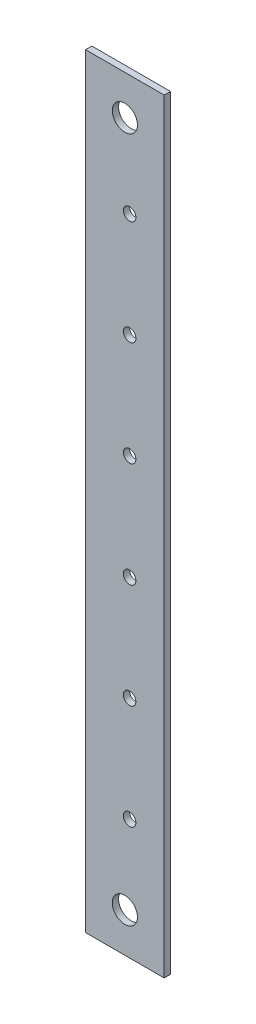
ISO-10303-21;
HEADER;
FILE_DESCRIPTION(('STEP AP214'),'2;1');
FILE_NAME('part.step','',(''),(''),'','','');
FILE_SCHEMA(('AUTOMOTIVE_DESIGN { 1 0 10303 214 1 1 1 1 }'));
ENDSEC;
DATA;
#1=APPLICATION_CONTEXT('core data for automotive mechanical design processes');
#2=APPLICATION_PROTOCOL_DEFINITION('international standard','automotive_design',2000,#1);
#3=PRODUCT_CONTEXT('',#1,'mechanical');
#4=PRODUCT('Part','Part','',(#3));
#5=PRODUCT_RELATED_PRODUCT_CATEGORY('part','',(#4));
#6=PRODUCT_DEFINITION_FORMATION('','',#4);
#7=PRODUCT_DEFINITION_CONTEXT('part definition',#1,'design');
#8=PRODUCT_DEFINITION('design','',#6,#7);
#9=PRODUCT_DEFINITION_SHAPE('','',#8);
#10=(LENGTH_UNIT() NAMED_UNIT(*) SI_UNIT(.MILLI.,.METRE.));
#11=(NAMED_UNIT(*) PLANE_ANGLE_UNIT() SI_UNIT($,.RADIAN.));
#12=(NAMED_UNIT(*) SI_UNIT($,.STERADIAN.) SOLID_ANGLE_UNIT());
#13=UNCERTAINTY_MEASURE_WITH_UNIT(LENGTH_MEASURE(1.E-05),#10,'distance_accuracy_value','');
#14=(GEOMETRIC_REPRESENTATION_CONTEXT(3) GLOBAL_UNCERTAINTY_ASSIGNED_CONTEXT((#13)) GLOBAL_UNIT_ASSIGNED_CONTEXT((#10,
#11,#12)) REPRESENTATION_CONTEXT('',''));
#15=CARTESIAN_POINT('',(0.,0.,0.));
#16=DIRECTION('',(0.,0.,1.));
#17=DIRECTION('',(1.,0.,0.));
#18=AXIS2_PLACEMENT_3D('',#15,#16,#17);
#19=CARTESIAN_POINT('',(0.,0.,2.));
#20=DIRECTION('',(0.,0.,1.));
#21=DIRECTION('',(1.,0.,0.));
#22=AXIS2_PLACEMENT_3D('',#19,#20,#21);
#23=PLANE('',#22);
#24=CARTESIAN_POINT('',(1.49999999999956,83.3000000000004,2.));
#25=DIRECTION('',(0.,0.,1.));
#26=DIRECTION('',(1.,0.,0.));
#27=AXIS2_PLACEMENT_3D('',#24,#25,#26);
#28=CIRCLE('',#27,2.);
#29=CARTESIAN_POINT('',(3.49999999999956,83.3000000000004,2.));
#30=VERTEX_POINT('',#29);
#31=EDGE_CURVE('E151',#30,#30,#28,.T.);
#32=ORIENTED_EDGE('',*,*,#31,.F.);
#33=EDGE_LOOP('',(#32));
#34=FACE_BOUND('',#33,.T.);
#35=CARTESIAN_POINT('',(1.49999999999956,50.0000000000004,2.));
#36=DIRECTION('',(0.,0.,1.));
#37=DIRECTION('',(1.,0.,0.));
#38=AXIS2_PLACEMENT_3D('',#35,#36,#37);
#39=CIRCLE('',#38,2.);
#40=CARTESIAN_POINT('',(3.49999999999956,50.0000000000004,2.));
#41=VERTEX_POINT('',#40);
#42=EDGE_CURVE('E145',#41,#41,#39,.T.);
#43=ORIENTED_EDGE('',*,*,#42,.F.);
#44=EDGE_LOOP('',(#43));
#45=FACE_BOUND('',#44,.T.);
#46=CARTESIAN_POINT('',(1.49999999999956,16.7000000000004,2.));
#47=DIRECTION('',(0.,0.,1.));
#48=DIRECTION('',(1.,0.,0.));
#49=AXIS2_PLACEMENT_3D('',#46,#47,#48);
#50=CIRCLE('',#49,2.);
#51=CARTESIAN_POINT('',(3.49999999999956,16.7000000000004,2.));
#52=VERTEX_POINT('',#51);
#53=EDGE_CURVE('E139',#52,#52,#50,.T.);
#54=ORIENTED_EDGE('',*,*,#53,.F.);
#55=EDGE_LOOP('',(#54));
#56=FACE_BOUND('',#55,.T.);
#57=CARTESIAN_POINT('',(1.49999999999956,-16.7000000000006,2.));
#58=DIRECTION('',(0.,0.,1.));
#59=DIRECTION('',(1.,0.,0.));
#60=AXIS2_PLACEMENT_3D('',#57,#58,#59);
#61=CIRCLE('',#60,2.00000000000027);
#62=CARTESIAN_POINT('',(3.49999999999983,-16.7000000000006,2.));
#63=VERTEX_POINT('',#62);
#64=EDGE_CURVE('E133',#63,#63,#61,.T.);
#65=ORIENTED_EDGE('',*,*,#64,.F.);
#66=EDGE_LOOP('',(#65));
#67=FACE_BOUND('',#66,.T.);
#68=CARTESIAN_POINT('',(1.49999999999956,-50.0000000000006,2.));
#69=DIRECTION('',(0.,0.,1.));
#70=DIRECTION('',(1.,0.,0.));
#71=AXIS2_PLACEMENT_3D('',#68,#69,#70);
#72=CIRCLE('',#71,2.00000000000027);
#73=CARTESIAN_POINT('',(3.49999999999983,-50.0000000000006,2.));
#74=VERTEX_POINT('',#73);
#75=EDGE_CURVE('E127',#74,#74,#72,.T.);
#76=ORIENTED_EDGE('',*,*,#75,.F.);
#77=EDGE_LOOP('',(#76));
#78=FACE_BOUND('',#77,.T.);
#79=CARTESIAN_POINT('',(1.49999999999956,-83.2999999999997,2.));
#80=DIRECTION('',(0.,0.,1.));
#81=DIRECTION('',(1.,0.,0.));
#82=AXIS2_PLACEMENT_3D('',#79,#80,#81);
#83=CIRCLE('',#82,2.);
#84=CARTESIAN_POINT('',(3.49999999999955,-83.2999999999997,2.));
#85=VERTEX_POINT('',#84);
#86=EDGE_CURVE('E121',#85,#85,#83,.T.);
#87=ORIENTED_EDGE('',*,*,#86,.F.);
#88=EDGE_LOOP('',(#87));
#89=FACE_BOUND('',#88,.T.);
#90=CARTESIAN_POINT('',(0.,109.,2.));
#91=DIRECTION('',(0.,0.,1.));
#92=DIRECTION('',(1.,0.,0.));
#93=AXIS2_PLACEMENT_3D('',#90,#91,#92);
#94=CIRCLE('',#93,4.);
#95=CARTESIAN_POINT('',(4.,109.,2.));
#96=VERTEX_POINT('',#95);
#97=EDGE_CURVE('E100',#96,#96,#94,.T.);
#98=ORIENTED_EDGE('',*,*,#97,.F.);
#99=EDGE_LOOP('',(#98));
#100=FACE_BOUND('',#99,.T.);
#101=DIRECTION('',(0.,1.,0.));
#102=VECTOR('',#101,1.);
#103=CARTESIAN_POINT('',(12.5,121.5,2.));
#104=LINE('',#103,#102);
#105=CARTESIAN_POINT('',(12.5,-121.5,2.));
#106=VERTEX_POINT('',#105);
#107=CARTESIAN_POINT('',(12.5,121.5,2.));
#108=VERTEX_POINT('',#107);
#109=EDGE_CURVE('E82',#106,#108,#104,.T.);
#110=ORIENTED_EDGE('',*,*,#109,.T.);
#111=DIRECTION('',(-1.,0.,0.));
#112=VECTOR('',#111,1.);
#113=CARTESIAN_POINT('',(3.5000000000001,121.5,2.));
#114=LINE('',#113,#112);
#115=CARTESIAN_POINT('',(-12.5,121.5,2.));
#116=VERTEX_POINT('',#115);
#117=EDGE_CURVE('E76',#108,#116,#114,.T.);
#118=ORIENTED_EDGE('',*,*,#117,.T.);
#119=DIRECTION('',(0.,-1.,0.));
#120=VECTOR('',#119,1.);
#121=CARTESIAN_POINT('',(-12.5,112.5,2.));
#122=LINE('',#121,#120);
#123=CARTESIAN_POINT('',(-12.5,-121.5,2.));
#124=VERTEX_POINT('',#123);
#125=EDGE_CURVE('E79',#116,#124,#122,.T.);
#126=ORIENTED_EDGE('',*,*,#125,.T.);
#127=DIRECTION('',(1.,0.,0.));
#128=VECTOR('',#127,1.);
#129=CARTESIAN_POINT('',(-12.5,-121.5,2.));
#130=LINE('',#129,#128);
#131=EDGE_CURVE('E49',#124,#106,#130,.T.);
#132=ORIENTED_EDGE('',*,*,#131,.T.);
#133=EDGE_LOOP('',(#110,#118,#126,#132));
#134=FACE_BOUND('',#133,.T.);
#135=CARTESIAN_POINT('',(0.,-109.,2.));
#136=DIRECTION('',(0.,0.,1.));
#137=DIRECTION('',(-1.,0.,0.));
#138=AXIS2_PLACEMENT_3D('',#135,#136,#137);
#139=CIRCLE('',#138,4.);
#140=CARTESIAN_POINT('',(-4.,-109.,2.));
#141=VERTEX_POINT('',#140);
#142=EDGE_CURVE('E112',#141,#141,#139,.T.);
#143=ORIENTED_EDGE('',*,*,#142,.F.);
#144=EDGE_LOOP('',(#143));
#145=FACE_BOUND('',#144,.T.);
#146=ADVANCED_FACE('F32',(#34,#45,#56,#67,#78,#89,#100,#134,#145),#23,.T.);
#147=CARTESIAN_POINT('',(0.,0.,0.));
#148=DIRECTION('',(0.,0.,1.));
#149=DIRECTION('',(1.,0.,0.));
#150=AXIS2_PLACEMENT_3D('',#147,#148,#149);
#151=PLANE('',#150);
#152=CARTESIAN_POINT('',(1.49999999999956,83.3000000000004,0.));
#153=DIRECTION('',(0.,0.,1.));
#154=DIRECTION('',(1.,0.,0.));
#155=AXIS2_PLACEMENT_3D('',#152,#153,#154);
#156=CIRCLE('',#155,2.);
#157=CARTESIAN_POINT('',(3.49999999999956,83.3000000000004,0.));
#158=VERTEX_POINT('',#157);
#159=EDGE_CURVE('E118',#158,#158,#156,.T.);
#160=ORIENTED_EDGE('',*,*,#159,.T.);
#161=EDGE_LOOP('',(#160));
#162=FACE_BOUND('',#161,.T.);
#163=CARTESIAN_POINT('',(1.49999999999956,50.0000000000004,0.));
#164=DIRECTION('',(0.,0.,1.));
#165=DIRECTION('',(1.,0.,0.));
#166=AXIS2_PLACEMENT_3D('',#163,#164,#165);
#167=CIRCLE('',#166,2.);
#168=CARTESIAN_POINT('',(3.49999999999956,50.0000000000004,0.));
#169=VERTEX_POINT('',#168);
#170=EDGE_CURVE('E148',#169,#169,#167,.T.);
#171=ORIENTED_EDGE('',*,*,#170,.T.);
#172=EDGE_LOOP('',(#171));
#173=FACE_BOUND('',#172,.T.);
#174=CARTESIAN_POINT('',(1.49999999999956,16.7000000000004,0.));
#175=DIRECTION('',(0.,0.,1.));
#176=DIRECTION('',(1.,0.,0.));
#177=AXIS2_PLACEMENT_3D('',#174,#175,#176);
#178=CIRCLE('',#177,2.);
#179=CARTESIAN_POINT('',(3.49999999999956,16.7000000000004,0.));
#180=VERTEX_POINT('',#179);
#181=EDGE_CURVE('E142',#180,#180,#178,.T.);
#182=ORIENTED_EDGE('',*,*,#181,.T.);
#183=EDGE_LOOP('',(#182));
#184=FACE_BOUND('',#183,.T.);
#185=CARTESIAN_POINT('',(1.49999999999956,-16.7000000000006,0.));
#186=DIRECTION('',(0.,0.,1.));
#187=DIRECTION('',(1.,0.,0.));
#188=AXIS2_PLACEMENT_3D('',#185,#186,#187);
#189=CIRCLE('',#188,2.00000000000027);
#190=CARTESIAN_POINT('',(3.49999999999983,-16.7000000000006,0.));
#191=VERTEX_POINT('',#190);
#192=EDGE_CURVE('E136',#191,#191,#189,.T.);
#193=ORIENTED_EDGE('',*,*,#192,.T.);
#194=EDGE_LOOP('',(#193));
#195=FACE_BOUND('',#194,.T.);
#196=CARTESIAN_POINT('',(1.49999999999956,-50.0000000000006,0.));
#197=DIRECTION('',(0.,0.,1.));
#198=DIRECTION('',(1.,0.,0.));
#199=AXIS2_PLACEMENT_3D('',#196,#197,#198);
#200=CIRCLE('',#199,2.00000000000027);
#201=CARTESIAN_POINT('',(3.49999999999983,-50.0000000000006,0.));
#202=VERTEX_POINT('',#201);
#203=EDGE_CURVE('E130',#202,#202,#200,.T.);
#204=ORIENTED_EDGE('',*,*,#203,.T.);
#205=EDGE_LOOP('',(#204));
#206=FACE_BOUND('',#205,.T.);
#207=CARTESIAN_POINT('',(1.49999999999956,-83.2999999999997,0.));
#208=DIRECTION('',(0.,0.,1.));
#209=DIRECTION('',(1.,0.,0.));
#210=AXIS2_PLACEMENT_3D('',#207,#208,#209);
#211=CIRCLE('',#210,2.);
#212=CARTESIAN_POINT('',(3.49999999999955,-83.2999999999997,0.));
#213=VERTEX_POINT('',#212);
#214=EDGE_CURVE('E124',#213,#213,#211,.T.);
#215=ORIENTED_EDGE('',*,*,#214,.T.);
#216=EDGE_LOOP('',(#215));
#217=FACE_BOUND('',#216,.T.);
#218=DIRECTION('',(0.,1.,0.));
#219=VECTOR('',#218,1.);
#220=CARTESIAN_POINT('',(12.5,121.5,0.));
#221=LINE('',#220,#219);
#222=CARTESIAN_POINT('',(12.5,-121.5,0.));
#223=VERTEX_POINT('',#222);
#224=CARTESIAN_POINT('',(12.5,121.5,0.));
#225=VERTEX_POINT('',#224);
#226=EDGE_CURVE('E97',#223,#225,#221,.T.);
#227=ORIENTED_EDGE('',*,*,#226,.F.);
#228=DIRECTION('',(1.,0.,0.));
#229=VECTOR('',#228,1.);
#230=CARTESIAN_POINT('',(3.50000000000013,-121.5,0.));
#231=LINE('',#230,#229);
#232=CARTESIAN_POINT('',(-12.5,-121.5,0.));
#233=VERTEX_POINT('',#232);
#234=EDGE_CURVE('E65',#233,#223,#231,.T.);
#235=ORIENTED_EDGE('',*,*,#234,.F.);
#236=DIRECTION('',(0.,-1.,0.));
#237=VECTOR('',#236,1.);
#238=CARTESIAN_POINT('',(-12.5,-115.487492177719,0.));
#239=LINE('',#238,#237);
#240=CARTESIAN_POINT('',(-12.5,121.5,0.));
#241=VERTEX_POINT('',#240);
#242=EDGE_CURVE('E102',#241,#233,#239,.T.);
#243=ORIENTED_EDGE('',*,*,#242,.F.);
#244=DIRECTION('',(-1.,0.,0.));
#245=VECTOR('',#244,1.);
#246=CARTESIAN_POINT('',(-12.5,121.5,0.));
#247=LINE('',#246,#245);
#248=EDGE_CURVE('E88',#225,#241,#247,.T.);
#249=ORIENTED_EDGE('',*,*,#248,.F.);
#250=EDGE_LOOP('',(#227,#235,#243,#249));
#251=FACE_BOUND('',#250,.T.);
#252=CARTESIAN_POINT('',(0.,109.,0.));
#253=DIRECTION('',(0.,0.,1.));
#254=DIRECTION('',(1.,0.,0.));
#255=AXIS2_PLACEMENT_3D('',#252,#253,#254);
#256=CIRCLE('',#255,4.);
#257=CARTESIAN_POINT('',(4.,109.,0.));
#258=VERTEX_POINT('',#257);
#259=EDGE_CURVE('E109',#258,#258,#256,.T.);
#260=ORIENTED_EDGE('',*,*,#259,.T.);
#261=EDGE_LOOP('',(#260));
#262=FACE_BOUND('',#261,.T.);
#263=CARTESIAN_POINT('',(0.,-109.,0.));
#264=DIRECTION('',(0.,0.,1.));
#265=DIRECTION('',(-1.,0.,0.));
#266=AXIS2_PLACEMENT_3D('',#263,#264,#265);
#267=CIRCLE('',#266,4.);
#268=CARTESIAN_POINT('',(-4.,-109.,0.));
#269=VERTEX_POINT('',#268);
#270=EDGE_CURVE('E115',#269,#269,#267,.T.);
#271=ORIENTED_EDGE('',*,*,#270,.T.);
#272=EDGE_LOOP('',(#271));
#273=FACE_BOUND('',#272,.T.);
#274=ADVANCED_FACE('F157',(#162,#173,#184,#195,#206,#217,#251,#262,#273),#151,.F.);
#275=CARTESIAN_POINT('',(12.5,121.5,2.));
#276=DIRECTION('',(-1.,0.,0.));
#277=DIRECTION('',(0.,0.,1.));
#278=AXIS2_PLACEMENT_3D('',#275,#276,#277);
#279=PLANE('',#278);
#280=ORIENTED_EDGE('',*,*,#226,.T.);
#281=DIRECTION('',(0.,0.,-1.));
#282=VECTOR('',#281,1.);
#283=CARTESIAN_POINT('',(12.5,121.5,2.));
#284=LINE('',#283,#282);
#285=EDGE_CURVE('E11',#108,#225,#284,.T.);
#286=ORIENTED_EDGE('',*,*,#285,.F.);
#287=ORIENTED_EDGE('',*,*,#109,.F.);
#288=DIRECTION('',(0.,0.,-1.));
#289=VECTOR('',#288,1.);
#290=CARTESIAN_POINT('',(12.5,-121.5,2.));
#291=LINE('',#290,#289);
#292=EDGE_CURVE('E93',#106,#223,#291,.T.);
#293=ORIENTED_EDGE('',*,*,#292,.T.);
#294=EDGE_LOOP('',(#280,#286,#287,#293));
#295=FACE_BOUND('',#294,.T.);
#296=ADVANCED_FACE('F34',(#295),#279,.F.);
#297=CARTESIAN_POINT('',(-12.5,121.5,2.));
#298=DIRECTION('',(0.,-1.,0.));
#299=DIRECTION('',(0.,0.,-1.));
#300=AXIS2_PLACEMENT_3D('',#297,#298,#299);
#301=PLANE('',#300);
#302=ORIENTED_EDGE('',*,*,#248,.T.);
#303=DIRECTION('',(0.,0.,-1.));
#304=VECTOR('',#303,1.);
#305=CARTESIAN_POINT('',(-12.5,121.5,2.));
#306=LINE('',#305,#304);
#307=EDGE_CURVE('E41',#116,#241,#306,.T.);
#308=ORIENTED_EDGE('',*,*,#307,.F.);
#309=ORIENTED_EDGE('',*,*,#117,.F.);
#310=ORIENTED_EDGE('',*,*,#285,.T.);
#311=EDGE_LOOP('',(#302,#308,#309,#310));
#312=FACE_BOUND('',#311,.T.);
#313=ADVANCED_FACE('F87',(#312),#301,.F.);
#314=CARTESIAN_POINT('',(-12.5,-115.487492177719,2.));
#315=DIRECTION('',(1.,0.,0.));
#316=DIRECTION('',(0.,0.,-1.));
#317=AXIS2_PLACEMENT_3D('',#314,#315,#316);
#318=PLANE('',#317);
#319=ORIENTED_EDGE('',*,*,#242,.T.);
#320=DIRECTION('',(0.,0.,-1.));
#321=VECTOR('',#320,1.);
#322=CARTESIAN_POINT('',(-12.5,-121.5,2.));
#323=LINE('',#322,#321);
#324=EDGE_CURVE('E90',#124,#233,#323,.T.);
#325=ORIENTED_EDGE('',*,*,#324,.F.);
#326=ORIENTED_EDGE('',*,*,#125,.F.);
#327=ORIENTED_EDGE('',*,*,#307,.T.);
#328=EDGE_LOOP('',(#319,#325,#326,#327));
#329=FACE_BOUND('',#328,.T.);
#330=ADVANCED_FACE('F91',(#329),#318,.F.);
#331=CARTESIAN_POINT('',(3.50000000000013,-121.5,2.));
#332=DIRECTION('',(0.,1.,0.));
#333=DIRECTION('',(0.,0.,1.));
#334=AXIS2_PLACEMENT_3D('',#331,#332,#333);
#335=PLANE('',#334);
#336=ORIENTED_EDGE('',*,*,#234,.T.);
#337=ORIENTED_EDGE('',*,*,#292,.F.);
#338=ORIENTED_EDGE('',*,*,#131,.F.);
#339=ORIENTED_EDGE('',*,*,#324,.T.);
#340=EDGE_LOOP('',(#336,#337,#338,#339));
#341=FACE_BOUND('',#340,.T.);
#342=ADVANCED_FACE('F106',(#341),#335,.F.);
#343=CARTESIAN_POINT('',(0.,109.,2.));
#344=DIRECTION('',(0.,0.,-1.));
#345=DIRECTION('',(-1.,0.,0.));
#346=AXIS2_PLACEMENT_3D('',#343,#344,#345);
#347=CYLINDRICAL_SURFACE('',#346,4.);
#348=ORIENTED_EDGE('',*,*,#97,.T.);
#349=EDGE_LOOP('',(#348));
#350=FACE_BOUND('',#349,.T.);
#351=ORIENTED_EDGE('',*,*,#259,.F.);
#352=EDGE_LOOP('',(#351));
#353=FACE_BOUND('',#352,.T.);
#354=ADVANCED_FACE('F182',(#350,#353),#347,.F.);
#355=CARTESIAN_POINT('',(0.,-109.,2.));
#356=DIRECTION('',(0.,0.,-1.));
#357=DIRECTION('',(-1.,0.,0.));
#358=AXIS2_PLACEMENT_3D('',#355,#356,#357);
#359=CYLINDRICAL_SURFACE('',#358,4.);
#360=ORIENTED_EDGE('',*,*,#142,.T.);
#361=EDGE_LOOP('',(#360));
#362=FACE_BOUND('',#361,.T.);
#363=ORIENTED_EDGE('',*,*,#270,.F.);
#364=EDGE_LOOP('',(#363));
#365=FACE_BOUND('',#364,.T.);
#366=ADVANCED_FACE('F185',(#362,#365),#359,.F.);
#367=CARTESIAN_POINT('',(1.49999999999956,-83.2999999999997,0.));
#368=DIRECTION('',(0.,0.,1.));
#369=DIRECTION('',(1.,0.,0.));
#370=AXIS2_PLACEMENT_3D('',#367,#368,#369);
#371=CYLINDRICAL_SURFACE('',#370,2.);
#372=ORIENTED_EDGE('',*,*,#214,.F.);
#373=EDGE_LOOP('',(#372));
#374=FACE_BOUND('',#373,.T.);
#375=ORIENTED_EDGE('',*,*,#86,.T.);
#376=EDGE_LOOP('',(#375));
#377=FACE_BOUND('',#376,.T.);
#378=ADVANCED_FACE('F195',(#374,#377),#371,.F.);
#379=CARTESIAN_POINT('',(1.49999999999956,-50.0000000000006,0.));
#380=DIRECTION('',(0.,0.,1.));
#381=DIRECTION('',(1.,0.,0.));
#382=AXIS2_PLACEMENT_3D('',#379,#380,#381);
#383=CYLINDRICAL_SURFACE('',#382,2.00000000000027);
#384=ORIENTED_EDGE('',*,*,#203,.F.);
#385=EDGE_LOOP('',(#384));
#386=FACE_BOUND('',#385,.T.);
#387=ORIENTED_EDGE('',*,*,#75,.T.);
#388=EDGE_LOOP('',(#387));
#389=FACE_BOUND('',#388,.T.);
#390=ADVANCED_FACE('F201',(#386,#389),#383,.F.);
#391=CARTESIAN_POINT('',(1.49999999999956,-16.7000000000006,0.));
#392=DIRECTION('',(0.,0.,1.));
#393=DIRECTION('',(1.,0.,0.));
#394=AXIS2_PLACEMENT_3D('',#391,#392,#393);
#395=CYLINDRICAL_SURFACE('',#394,2.00000000000027);
#396=ORIENTED_EDGE('',*,*,#192,.F.);
#397=EDGE_LOOP('',(#396));
#398=FACE_BOUND('',#397,.T.);
#399=ORIENTED_EDGE('',*,*,#64,.T.);
#400=EDGE_LOOP('',(#399));
#401=FACE_BOUND('',#400,.T.);
#402=ADVANCED_FACE('F286',(#398,#401),#395,.F.);
#403=CARTESIAN_POINT('',(1.49999999999956,16.7000000000004,0.));
#404=DIRECTION('',(0.,0.,1.));
#405=DIRECTION('',(1.,0.,0.));
#406=AXIS2_PLACEMENT_3D('',#403,#404,#405);
#407=CYLINDRICAL_SURFACE('',#406,2.);
#408=ORIENTED_EDGE('',*,*,#181,.F.);
#409=EDGE_LOOP('',(#408));
#410=FACE_BOUND('',#409,.T.);
#411=ORIENTED_EDGE('',*,*,#53,.T.);
#412=EDGE_LOOP('',(#411));
#413=FACE_BOUND('',#412,.T.);
#414=ADVANCED_FACE('F294',(#410,#413),#407,.F.);
#415=CARTESIAN_POINT('',(1.49999999999956,50.0000000000004,0.));
#416=DIRECTION('',(0.,0.,1.));
#417=DIRECTION('',(1.,0.,0.));
#418=AXIS2_PLACEMENT_3D('',#415,#416,#417);
#419=CYLINDRICAL_SURFACE('',#418,2.);
#420=ORIENTED_EDGE('',*,*,#170,.F.);
#421=EDGE_LOOP('',(#420));
#422=FACE_BOUND('',#421,.T.);
#423=ORIENTED_EDGE('',*,*,#42,.T.);
#424=EDGE_LOOP('',(#423));
#425=FACE_BOUND('',#424,.T.);
#426=ADVANCED_FACE('F163',(#422,#425),#419,.F.);
#427=CARTESIAN_POINT('',(1.49999999999956,83.3000000000004,0.));
#428=DIRECTION('',(0.,0.,1.));
#429=DIRECTION('',(1.,0.,0.));
#430=AXIS2_PLACEMENT_3D('',#427,#428,#429);
#431=CYLINDRICAL_SURFACE('',#430,2.);
#432=ORIENTED_EDGE('',*,*,#159,.F.);
#433=EDGE_LOOP('',(#432));
#434=FACE_BOUND('',#433,.T.);
#435=ORIENTED_EDGE('',*,*,#31,.T.);
#436=EDGE_LOOP('',(#435));
#437=FACE_BOUND('',#436,.T.);
#438=ADVANCED_FACE('F160',(#434,#437),#431,.F.);
#439=CLOSED_SHELL('',(#146,#274,#296,#313,#330,#342,#354,#366,#378,#390,#402,#414,#426,#438));
#440=MANIFOLD_SOLID_BREP('B2',#439);
#441=ADVANCED_BREP_SHAPE_REPRESENTATION('',(#18,#440),#14);
#442=SHAPE_DEFINITION_REPRESENTATION(#9,#441);
ENDSEC;
END-ISO-10303-21;
